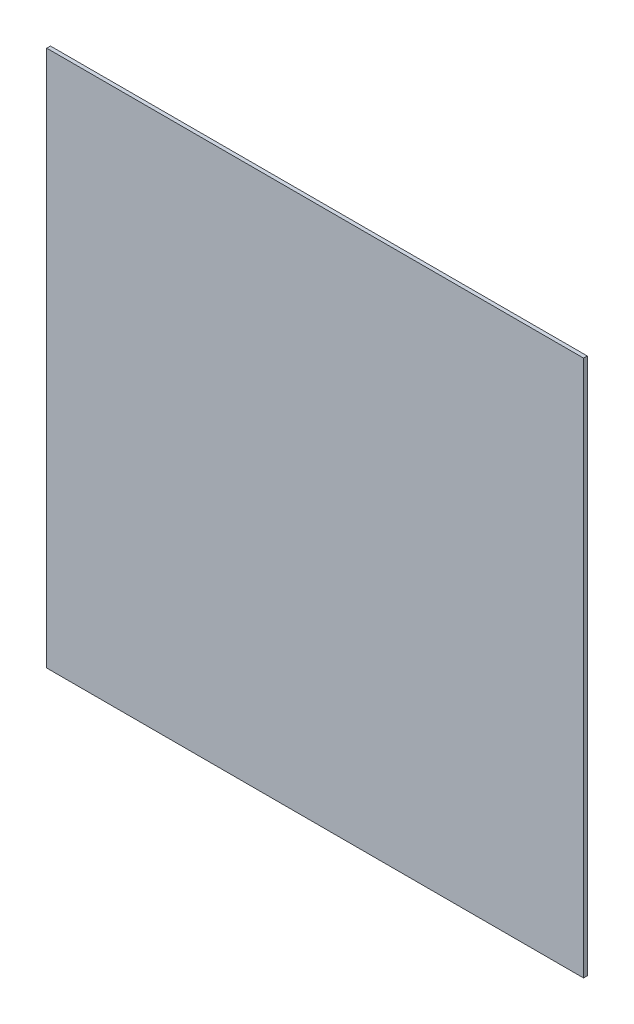
ISO-10303-21;
HEADER;
FILE_DESCRIPTION(('STEP AP214'),'2;1');
FILE_NAME('part.step','',(''),(''),'','','');
FILE_SCHEMA(('AUTOMOTIVE_DESIGN { 1 0 10303 214 1 1 1 1 }'));
ENDSEC;
DATA;
#1=APPLICATION_CONTEXT('core data for automotive mechanical design processes');
#2=APPLICATION_PROTOCOL_DEFINITION('international standard','automotive_design',2000,#1);
#3=PRODUCT_CONTEXT('',#1,'mechanical');
#4=PRODUCT('Part','Part','',(#3));
#5=PRODUCT_RELATED_PRODUCT_CATEGORY('part','',(#4));
#6=PRODUCT_DEFINITION_FORMATION('','',#4);
#7=PRODUCT_DEFINITION_CONTEXT('part definition',#1,'design');
#8=PRODUCT_DEFINITION('design','',#6,#7);
#9=PRODUCT_DEFINITION_SHAPE('','',#8);
#10=(LENGTH_UNIT() NAMED_UNIT(*) SI_UNIT(.MILLI.,.METRE.));
#11=(NAMED_UNIT(*) PLANE_ANGLE_UNIT() SI_UNIT($,.RADIAN.));
#12=(NAMED_UNIT(*) SI_UNIT($,.STERADIAN.) SOLID_ANGLE_UNIT());
#13=UNCERTAINTY_MEASURE_WITH_UNIT(LENGTH_MEASURE(1.E-05),#10,'distance_accuracy_value','');
#14=(GEOMETRIC_REPRESENTATION_CONTEXT(3) GLOBAL_UNCERTAINTY_ASSIGNED_CONTEXT((#13)) GLOBAL_UNIT_ASSIGNED_CONTEXT((#10,
#11,#12)) REPRESENTATION_CONTEXT('',''));
#15=CARTESIAN_POINT('',(0.,0.,0.));
#16=DIRECTION('',(0.,0.,1.));
#17=DIRECTION('',(1.,0.,0.));
#18=AXIS2_PLACEMENT_3D('',#15,#16,#17);
#19=CARTESIAN_POINT('',(228.6,-228.6,3.175));
#20=DIRECTION('',(-1.,0.,0.));
#21=DIRECTION('',(0.,0.,1.));
#22=AXIS2_PLACEMENT_3D('',#19,#20,#21);
#23=PLANE('',#22);
#24=DIRECTION('',(0.,1.,0.));
#25=VECTOR('',#24,1.);
#26=CARTESIAN_POINT('',(228.6,-228.6,0.));
#27=LINE('',#26,#25);
#28=CARTESIAN_POINT('',(228.6,-228.6,0.));
#29=VERTEX_POINT('',#28);
#30=CARTESIAN_POINT('',(228.6,228.6,0.));
#31=VERTEX_POINT('',#30);
#32=EDGE_CURVE('E95',#29,#31,#27,.T.);
#33=ORIENTED_EDGE('',*,*,#32,.T.);
#34=DIRECTION('',(0.,0.,-1.));
#35=VECTOR('',#34,1.);
#36=CARTESIAN_POINT('',(228.6,228.6,3.175));
#37=LINE('',#36,#35);
#38=CARTESIAN_POINT('',(228.6,228.6,3.175));
#39=VERTEX_POINT('',#38);
#40=EDGE_CURVE('E11',#39,#31,#37,.T.);
#41=ORIENTED_EDGE('',*,*,#40,.F.);
#42=DIRECTION('',(0.,1.,0.));
#43=VECTOR('',#42,1.);
#44=CARTESIAN_POINT('',(228.6,-228.6,3.175));
#45=LINE('',#44,#43);
#46=CARTESIAN_POINT('',(228.6,-228.6,3.175));
#47=VERTEX_POINT('',#46);
#48=EDGE_CURVE('E83',#47,#39,#45,.T.);
#49=ORIENTED_EDGE('',*,*,#48,.F.);
#50=DIRECTION('',(0.,0.,-1.));
#51=VECTOR('',#50,1.);
#52=CARTESIAN_POINT('',(228.6,-228.6,3.175));
#53=LINE('',#52,#51);
#54=EDGE_CURVE('E91',#47,#29,#53,.T.);
#55=ORIENTED_EDGE('',*,*,#54,.T.);
#56=EDGE_LOOP('',(#33,#41,#49,#55));
#57=FACE_BOUND('',#56,.T.);
#58=ADVANCED_FACE('F32',(#57),#23,.F.);
#59=CARTESIAN_POINT('',(-228.6,228.6,3.175));
#60=DIRECTION('',(0.,-1.,0.));
#61=DIRECTION('',(0.,0.,-1.));
#62=AXIS2_PLACEMENT_3D('',#59,#60,#61);
#63=PLANE('',#62);
#64=DIRECTION('',(-1.,0.,0.));
#65=VECTOR('',#64,1.);
#66=CARTESIAN_POINT('',(-228.6,228.6,0.));
#67=LINE('',#66,#65);
#68=CARTESIAN_POINT('',(-228.6,228.6,0.));
#69=VERTEX_POINT('',#68);
#70=EDGE_CURVE('E87',#31,#69,#67,.T.);
#71=ORIENTED_EDGE('',*,*,#70,.T.);
#72=DIRECTION('',(0.,0.,-1.));
#73=VECTOR('',#72,1.);
#74=CARTESIAN_POINT('',(-228.6,228.6,3.175));
#75=LINE('',#74,#73);
#76=CARTESIAN_POINT('',(-228.6,228.6,3.175));
#77=VERTEX_POINT('',#76);
#78=EDGE_CURVE('E40',#77,#69,#75,.T.);
#79=ORIENTED_EDGE('',*,*,#78,.F.);
#80=DIRECTION('',(-1.,0.,0.));
#81=VECTOR('',#80,1.);
#82=CARTESIAN_POINT('',(-228.6,228.6,3.175));
#83=LINE('',#82,#81);
#84=EDGE_CURVE('E78',#39,#77,#83,.T.);
#85=ORIENTED_EDGE('',*,*,#84,.F.);
#86=ORIENTED_EDGE('',*,*,#40,.T.);
#87=EDGE_LOOP('',(#71,#79,#85,#86));
#88=FACE_BOUND('',#87,.T.);
#89=ADVANCED_FACE('F86',(#88),#63,.F.);
#90=CARTESIAN_POINT('',(-228.6,-228.6,3.175));
#91=DIRECTION('',(1.,0.,0.));
#92=DIRECTION('',(0.,0.,-1.));
#93=AXIS2_PLACEMENT_3D('',#90,#91,#92);
#94=PLANE('',#93);
#95=DIRECTION('',(0.,-1.,0.));
#96=VECTOR('',#95,1.);
#97=CARTESIAN_POINT('',(-228.6,-228.6,0.));
#98=LINE('',#97,#96);
#99=CARTESIAN_POINT('',(-228.6,-228.6,0.));
#100=VERTEX_POINT('',#99);
#101=EDGE_CURVE('E65',#69,#100,#98,.T.);
#102=ORIENTED_EDGE('',*,*,#101,.T.);
#103=DIRECTION('',(0.,0.,-1.));
#104=VECTOR('',#103,1.);
#105=CARTESIAN_POINT('',(-228.6,-228.6,3.175));
#106=LINE('',#105,#104);
#107=CARTESIAN_POINT('',(-228.6,-228.6,3.175));
#108=VERTEX_POINT('',#107);
#109=EDGE_CURVE('E88',#108,#100,#106,.T.);
#110=ORIENTED_EDGE('',*,*,#109,.F.);
#111=DIRECTION('',(0.,-1.,0.));
#112=VECTOR('',#111,1.);
#113=CARTESIAN_POINT('',(-228.6,-228.6,3.175));
#114=LINE('',#113,#112);
#115=EDGE_CURVE('E81',#77,#108,#114,.T.);
#116=ORIENTED_EDGE('',*,*,#115,.F.);
#117=ORIENTED_EDGE('',*,*,#78,.T.);
#118=EDGE_LOOP('',(#102,#110,#116,#117));
#119=FACE_BOUND('',#118,.T.);
#120=ADVANCED_FACE('F89',(#119),#94,.F.);
#121=CARTESIAN_POINT('',(-228.6,-228.6,3.175));
#122=DIRECTION('',(0.,1.,0.));
#123=DIRECTION('',(0.,0.,1.));
#124=AXIS2_PLACEMENT_3D('',#121,#122,#123);
#125=PLANE('',#124);
#126=DIRECTION('',(1.,0.,0.));
#127=VECTOR('',#126,1.);
#128=CARTESIAN_POINT('',(-228.6,-228.6,0.));
#129=LINE('',#128,#127);
#130=EDGE_CURVE('E71',#100,#29,#129,.T.);
#131=ORIENTED_EDGE('',*,*,#130,.T.);
#132=ORIENTED_EDGE('',*,*,#54,.F.);
#133=DIRECTION('',(1.,0.,0.));
#134=VECTOR('',#133,1.);
#135=CARTESIAN_POINT('',(-228.6,-228.6,3.175));
#136=LINE('',#135,#134);
#137=EDGE_CURVE('E48',#108,#47,#136,.T.);
#138=ORIENTED_EDGE('',*,*,#137,.F.);
#139=ORIENTED_EDGE('',*,*,#109,.T.);
#140=EDGE_LOOP('',(#131,#132,#138,#139));
#141=FACE_BOUND('',#140,.T.);
#142=ADVANCED_FACE('F102',(#141),#125,.F.);
#143=CARTESIAN_POINT('',(0.,0.,3.175));
#144=DIRECTION('',(0.,0.,-1.));
#145=DIRECTION('',(-1.,0.,0.));
#146=AXIS2_PLACEMENT_3D('',#143,#144,#145);
#147=PLANE('',#146);
#148=ORIENTED_EDGE('',*,*,#48,.T.);
#149=ORIENTED_EDGE('',*,*,#84,.T.);
#150=ORIENTED_EDGE('',*,*,#115,.T.);
#151=ORIENTED_EDGE('',*,*,#137,.T.);
#152=EDGE_LOOP('',(#148,#149,#150,#151));
#153=FACE_BOUND('',#152,.T.);
#154=ADVANCED_FACE('F79',(#153),#147,.F.);
#155=CARTESIAN_POINT('',(0.,0.,0.));
#156=DIRECTION('',(0.,0.,-1.));
#157=DIRECTION('',(-1.,0.,0.));
#158=AXIS2_PLACEMENT_3D('',#155,#156,#157);
#159=PLANE('',#158);
#160=ORIENTED_EDGE('',*,*,#32,.F.);
#161=ORIENTED_EDGE('',*,*,#130,.F.);
#162=ORIENTED_EDGE('',*,*,#101,.F.);
#163=ORIENTED_EDGE('',*,*,#70,.F.);
#164=EDGE_LOOP('',(#160,#161,#162,#163));
#165=FACE_BOUND('',#164,.T.);
#166=ADVANCED_FACE('F105',(#165),#159,.T.);
#167=CLOSED_SHELL('',(#58,#89,#120,#142,#154,#166));
#168=MANIFOLD_SOLID_BREP('B2',#167);
#169=ADVANCED_BREP_SHAPE_REPRESENTATION('',(#18,#168),#14);
#170=SHAPE_DEFINITION_REPRESENTATION(#9,#169);
ENDSEC;
END-ISO-10303-21;
